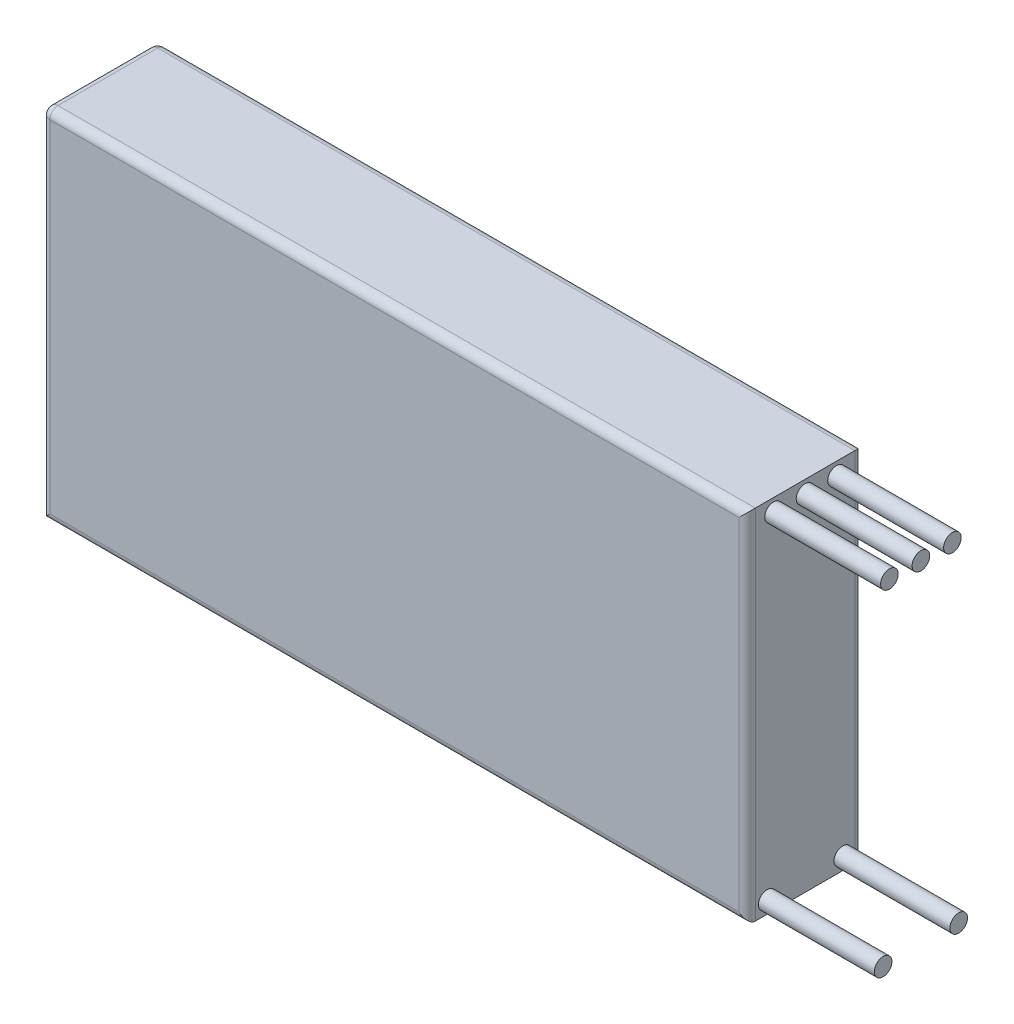
ISO-10303-21;
HEADER;
FILE_DESCRIPTION(('STEP AP214'),'2;1');
FILE_NAME('part.step','',(''),(''),'','','');
FILE_SCHEMA(('AUTOMOTIVE_DESIGN { 1 0 10303 214 1 1 1 1 }'));
ENDSEC;
DATA;
#1=APPLICATION_CONTEXT('core data for automotive mechanical design processes');
#2=APPLICATION_PROTOCOL_DEFINITION('international standard','automotive_design',2000,#1);
#3=PRODUCT_CONTEXT('',#1,'mechanical');
#4=PRODUCT('Part','Part','',(#3));
#5=PRODUCT_RELATED_PRODUCT_CATEGORY('part','',(#4));
#6=PRODUCT_DEFINITION_FORMATION('','',#4);
#7=PRODUCT_DEFINITION_CONTEXT('part definition',#1,'design');
#8=PRODUCT_DEFINITION('design','',#6,#7);
#9=PRODUCT_DEFINITION_SHAPE('','',#8);
#10=(LENGTH_UNIT() NAMED_UNIT(*) SI_UNIT(.MILLI.,.METRE.));
#11=(NAMED_UNIT(*) PLANE_ANGLE_UNIT() SI_UNIT($,.RADIAN.));
#12=(NAMED_UNIT(*) SI_UNIT($,.STERADIAN.) SOLID_ANGLE_UNIT());
#13=UNCERTAINTY_MEASURE_WITH_UNIT(LENGTH_MEASURE(1.E-05),#10,'distance_accuracy_value','');
#14=(GEOMETRIC_REPRESENTATION_CONTEXT(3) GLOBAL_UNCERTAINTY_ASSIGNED_CONTEXT((#13)) GLOBAL_UNIT_ASSIGNED_CONTEXT((#10,
#11,#12)) REPRESENTATION_CONTEXT('',''));
#15=CARTESIAN_POINT('',(0.,0.,0.));
#16=DIRECTION('',(0.,0.,1.));
#17=DIRECTION('',(1.,0.,0.));
#18=AXIS2_PLACEMENT_3D('',#15,#16,#17);
#19=CARTESIAN_POINT('',(0.,0.,11.684));
#20=DIRECTION('',(1.,0.,0.));
#21=DIRECTION('',(0.,0.,-1.));
#22=AXIS2_PLACEMENT_3D('',#19,#20,#21);
#23=PLANE('',#22);
#24=DIRECTION('',(0.,0.,-1.));
#25=VECTOR('',#24,1.);
#26=CARTESIAN_POINT('',(0.,35.2425,11.684));
#27=LINE('',#26,#25);
#28=CARTESIAN_POINT('',(0.,35.2425,10.8585));
#29=VERTEX_POINT('',#28);
#30=CARTESIAN_POINT('',(0.,35.2425,0.8255));
#31=VERTEX_POINT('',#30);
#32=EDGE_CURVE('E182',#29,#31,#27,.T.);
#33=ORIENTED_EDGE('',*,*,#32,.T.);
#34=DIRECTION('',(0.,-1.,0.));
#35=VECTOR('',#34,1.);
#36=CARTESIAN_POINT('',(0.,0.,0.8255));
#37=LINE('',#36,#35);
#38=CARTESIAN_POINT('',(0.,0.,0.8255));
#39=VERTEX_POINT('',#38);
#40=EDGE_CURVE('E188',#31,#39,#37,.T.);
#41=ORIENTED_EDGE('',*,*,#40,.T.);
#42=DIRECTION('',(0.,0.,-1.));
#43=VECTOR('',#42,1.);
#44=CARTESIAN_POINT('',(0.,0.,11.684));
#45=LINE('',#44,#43);
#46=CARTESIAN_POINT('',(0.,0.,10.8585));
#47=VERTEX_POINT('',#46);
#48=EDGE_CURVE('E136',#47,#39,#45,.T.);
#49=ORIENTED_EDGE('',*,*,#48,.F.);
#50=DIRECTION('',(0.,-1.,0.));
#51=VECTOR('',#50,1.);
#52=CARTESIAN_POINT('',(0.,0.,10.8585));
#53=LINE('',#52,#51);
#54=EDGE_CURVE('E185',#47,#29,#53,.F.);
#55=ORIENTED_EDGE('',*,*,#54,.T.);
#56=EDGE_LOOP('',(#33,#41,#49,#55));
#57=FACE_BOUND('',#56,.T.);
#58=ADVANCED_FACE('F41',(#57),#23,.F.);
#59=CARTESIAN_POINT('',(0.,0.,11.684));
#60=DIRECTION('',(0.,1.,0.));
#61=DIRECTION('',(0.,0.,1.));
#62=AXIS2_PLACEMENT_3D('',#59,#60,#61);
#63=PLANE('',#62);
#64=ORIENTED_EDGE('',*,*,#48,.T.);
#65=DIRECTION('',(1.,0.,0.));
#66=VECTOR('',#65,1.);
#67=CARTESIAN_POINT('',(71.12,0.,0.8255));
#68=LINE('',#67,#66);
#69=CARTESIAN_POINT('',(71.12,0.,0.8255));
#70=VERTEX_POINT('',#69);
#71=EDGE_CURVE('E134',#39,#70,#68,.T.);
#72=ORIENTED_EDGE('',*,*,#71,.T.);
#73=DIRECTION('',(0.,0.,-1.));
#74=VECTOR('',#73,1.);
#75=CARTESIAN_POINT('',(71.12,0.,11.684));
#76=LINE('',#75,#74);
#77=CARTESIAN_POINT('',(71.12,0.,10.8585));
#78=VERTEX_POINT('',#77);
#79=EDGE_CURVE('E116',#78,#70,#76,.T.);
#80=ORIENTED_EDGE('',*,*,#79,.F.);
#81=DIRECTION('',(1.,0.,0.));
#82=VECTOR('',#81,1.);
#83=CARTESIAN_POINT('',(0.,0.,10.8585));
#84=LINE('',#83,#82);
#85=EDGE_CURVE('E131',#78,#47,#84,.F.);
#86=ORIENTED_EDGE('',*,*,#85,.T.);
#87=EDGE_LOOP('',(#64,#72,#80,#86));
#88=FACE_BOUND('',#87,.T.);
#89=ADVANCED_FACE('F129',(#88),#63,.F.);
#90=CARTESIAN_POINT('',(71.12,0.,11.684));
#91=DIRECTION('',(-1.,0.,0.));
#92=DIRECTION('',(0.,0.,1.));
#93=AXIS2_PLACEMENT_3D('',#90,#91,#92);
#94=PLANE('',#93);
#95=CARTESIAN_POINT('',(71.12,34.798,2.66700000000001));
#96=DIRECTION('',(-1.,0.,0.));
#97=DIRECTION('',(0.,0.,1.));
#98=AXIS2_PLACEMENT_3D('',#95,#96,#97);
#99=CIRCLE('',#98,0.888999999999993);
#100=CARTESIAN_POINT('',(71.12,34.798,3.556));
#101=VERTEX_POINT('',#100);
#102=EDGE_CURVE('E149',#101,#101,#99,.F.);
#103=ORIENTED_EDGE('',*,*,#102,.F.);
#104=EDGE_LOOP('',(#103));
#105=FACE_BOUND('',#104,.T.);
#106=CARTESIAN_POINT('',(71.12,34.798,5.842));
#107=DIRECTION('',(-1.,0.,0.));
#108=DIRECTION('',(0.,0.,1.));
#109=AXIS2_PLACEMENT_3D('',#106,#107,#108);
#110=CIRCLE('',#109,0.888999999999997);
#111=CARTESIAN_POINT('',(71.12,34.798,6.731));
#112=VERTEX_POINT('',#111);
#113=EDGE_CURVE('E156',#112,#112,#110,.F.);
#114=ORIENTED_EDGE('',*,*,#113,.F.);
#115=EDGE_LOOP('',(#114));
#116=FACE_BOUND('',#115,.T.);
#117=CARTESIAN_POINT('',(71.12,34.798,9.017));
#118=DIRECTION('',(-1.,0.,0.));
#119=DIRECTION('',(0.,0.,1.));
#120=AXIS2_PLACEMENT_3D('',#117,#118,#119);
#121=CIRCLE('',#120,0.888999999999996);
#122=CARTESIAN_POINT('',(71.12,34.798,9.906));
#123=VERTEX_POINT('',#122);
#124=EDGE_CURVE('E261',#123,#123,#121,.F.);
#125=ORIENTED_EDGE('',*,*,#124,.F.);
#126=EDGE_LOOP('',(#125));
#127=FACE_BOUND('',#126,.T.);
#128=CARTESIAN_POINT('',(71.12,1.27,2.032));
#129=DIRECTION('',(-1.,0.,0.));
#130=DIRECTION('',(0.,0.,1.));
#131=AXIS2_PLACEMENT_3D('',#128,#129,#130);
#132=CIRCLE('',#131,0.889);
#133=CARTESIAN_POINT('',(71.12,1.27,2.921));
#134=VERTEX_POINT('',#133);
#135=EDGE_CURVE('E254',#134,#134,#132,.F.);
#136=ORIENTED_EDGE('',*,*,#135,.F.);
#137=EDGE_LOOP('',(#136));
#138=FACE_BOUND('',#137,.T.);
#139=CARTESIAN_POINT('',(71.12,1.27,9.652));
#140=DIRECTION('',(-1.,0.,0.));
#141=DIRECTION('',(0.,0.,1.));
#142=AXIS2_PLACEMENT_3D('',#139,#140,#141);
#143=CIRCLE('',#142,0.889000000000002);
#144=CARTESIAN_POINT('',(71.12,1.27,10.541));
#145=VERTEX_POINT('',#144);
#146=EDGE_CURVE('E250',#145,#145,#143,.F.);
#147=ORIENTED_EDGE('',*,*,#146,.F.);
#148=EDGE_LOOP('',(#147));
#149=FACE_BOUND('',#148,.T.);
#150=ORIENTED_EDGE('',*,*,#79,.T.);
#151=DIRECTION('',(0.,1.,0.));
#152=VECTOR('',#151,1.);
#153=CARTESIAN_POINT('',(71.12,36.068,0.8255));
#154=LINE('',#153,#152);
#155=CARTESIAN_POINT('',(71.12,36.068,0.8255));
#156=VERTEX_POINT('',#155);
#157=EDGE_CURVE('E123',#70,#156,#154,.T.);
#158=ORIENTED_EDGE('',*,*,#157,.T.);
#159=DIRECTION('',(0.,0.,-1.));
#160=VECTOR('',#159,1.);
#161=CARTESIAN_POINT('',(71.12,36.068,11.684));
#162=LINE('',#161,#160);
#163=CARTESIAN_POINT('',(71.12,36.068,10.8585));
#164=VERTEX_POINT('',#163);
#165=EDGE_CURVE('E118',#164,#156,#162,.T.);
#166=ORIENTED_EDGE('',*,*,#165,.F.);
#167=DIRECTION('',(0.,1.,0.));
#168=VECTOR('',#167,1.);
#169=CARTESIAN_POINT('',(71.12,0.,10.8585));
#170=LINE('',#169,#168);
#171=EDGE_CURVE('E113',#164,#78,#170,.F.);
#172=ORIENTED_EDGE('',*,*,#171,.T.);
#173=EDGE_LOOP('',(#150,#158,#166,#172));
#174=FACE_BOUND('',#173,.T.);
#175=ADVANCED_FACE('F115',(#105,#116,#127,#138,#149,#174),#94,.F.);
#176=CARTESIAN_POINT('',(0.,36.068,11.684));
#177=DIRECTION('',(0.,-1.,0.));
#178=DIRECTION('',(0.,0.,-1.));
#179=AXIS2_PLACEMENT_3D('',#176,#177,#178);
#180=PLANE('',#179);
#181=ORIENTED_EDGE('',*,*,#165,.T.);
#182=DIRECTION('',(-1.,0.,0.));
#183=VECTOR('',#182,1.);
#184=CARTESIAN_POINT('',(0.,36.068,0.8255));
#185=LINE('',#184,#183);
#186=CARTESIAN_POINT('',(0.8255,36.068,0.8255));
#187=VERTEX_POINT('',#186);
#188=EDGE_CURVE('E179',#156,#187,#185,.T.);
#189=ORIENTED_EDGE('',*,*,#188,.T.);
#190=DIRECTION('',(0.,0.,-1.));
#191=VECTOR('',#190,1.);
#192=CARTESIAN_POINT('',(0.8255,36.068,11.684));
#193=LINE('',#192,#191);
#194=CARTESIAN_POINT('',(0.8255,36.068,10.8585));
#195=VERTEX_POINT('',#194);
#196=EDGE_CURVE('E173',#187,#195,#193,.F.);
#197=ORIENTED_EDGE('',*,*,#196,.T.);
#198=DIRECTION('',(-1.,0.,0.));
#199=VECTOR('',#198,1.);
#200=CARTESIAN_POINT('',(0.,36.068,10.8585));
#201=LINE('',#200,#199);
#202=EDGE_CURVE('E176',#195,#164,#201,.F.);
#203=ORIENTED_EDGE('',*,*,#202,.T.);
#204=EDGE_LOOP('',(#181,#189,#197,#203));
#205=FACE_BOUND('',#204,.T.);
#206=ADVANCED_FACE('F272',(#205),#180,.F.);
#207=CARTESIAN_POINT('',(0.,0.,11.684));
#208=DIRECTION('',(0.,0.,-1.));
#209=DIRECTION('',(-1.,0.,0.));
#210=AXIS2_PLACEMENT_3D('',#207,#208,#209);
#211=PLANE('',#210);
#212=DIRECTION('',(0.,1.,0.));
#213=VECTOR('',#212,1.);
#214=CARTESIAN_POINT('',(70.2945,0.,11.684));
#215=LINE('',#214,#213);
#216=CARTESIAN_POINT('',(70.2945,0.8255,11.684));
#217=VERTEX_POINT('',#216);
#218=CARTESIAN_POINT('',(70.2945,35.2425,11.684));
#219=VERTEX_POINT('',#218);
#220=EDGE_CURVE('E51',#217,#219,#215,.T.);
#221=ORIENTED_EDGE('',*,*,#220,.T.);
#222=DIRECTION('',(-1.,0.,0.));
#223=VECTOR('',#222,1.);
#224=CARTESIAN_POINT('',(0.,35.2425,11.684));
#225=LINE('',#224,#223);
#226=CARTESIAN_POINT('',(0.8255,35.2425,11.684));
#227=VERTEX_POINT('',#226);
#228=EDGE_CURVE('E11',#219,#227,#225,.T.);
#229=ORIENTED_EDGE('',*,*,#228,.T.);
#230=DIRECTION('',(0.,-1.,0.));
#231=VECTOR('',#230,1.);
#232=CARTESIAN_POINT('',(0.8255,0.,11.684));
#233=LINE('',#232,#231);
#234=CARTESIAN_POINT('',(0.8255,0.8255,11.684));
#235=VERTEX_POINT('',#234);
#236=EDGE_CURVE('E191',#227,#235,#233,.T.);
#237=ORIENTED_EDGE('',*,*,#236,.T.);
#238=DIRECTION('',(1.,0.,0.));
#239=VECTOR('',#238,1.);
#240=CARTESIAN_POINT('',(0.,0.8255,11.684));
#241=LINE('',#240,#239);
#242=EDGE_CURVE('E62',#235,#217,#241,.T.);
#243=ORIENTED_EDGE('',*,*,#242,.T.);
#244=EDGE_LOOP('',(#221,#229,#237,#243));
#245=FACE_BOUND('',#244,.T.);
#246=ADVANCED_FACE('F239',(#245),#211,.F.);
#247=CARTESIAN_POINT('',(0.,0.,0.));
#248=DIRECTION('',(0.,0.,-1.));
#249=DIRECTION('',(-1.,0.,0.));
#250=AXIS2_PLACEMENT_3D('',#247,#248,#249);
#251=PLANE('',#250);
#252=DIRECTION('',(0.,1.,0.));
#253=VECTOR('',#252,1.);
#254=CARTESIAN_POINT('',(70.2945,0.,0.));
#255=LINE('',#254,#253);
#256=CARTESIAN_POINT('',(70.2945,35.2425,0.));
#257=VERTEX_POINT('',#256);
#258=CARTESIAN_POINT('',(70.2945,0.8255,0.));
#259=VERTEX_POINT('',#258);
#260=EDGE_CURVE('E165',#257,#259,#255,.F.);
#261=ORIENTED_EDGE('',*,*,#260,.T.);
#262=DIRECTION('',(1.,0.,0.));
#263=VECTOR('',#262,1.);
#264=CARTESIAN_POINT('',(0.,0.8255,0.));
#265=LINE('',#264,#263);
#266=CARTESIAN_POINT('',(0.8255,0.8255,0.));
#267=VERTEX_POINT('',#266);
#268=EDGE_CURVE('E124',#259,#267,#265,.F.);
#269=ORIENTED_EDGE('',*,*,#268,.T.);
#270=DIRECTION('',(0.,-1.,0.));
#271=VECTOR('',#270,1.);
#272=CARTESIAN_POINT('',(0.8255,36.068,0.));
#273=LINE('',#272,#271);
#274=CARTESIAN_POINT('',(0.8255,35.2425,0.));
#275=VERTEX_POINT('',#274);
#276=EDGE_CURVE('E153',#267,#275,#273,.F.);
#277=ORIENTED_EDGE('',*,*,#276,.T.);
#278=DIRECTION('',(-1.,0.,0.));
#279=VECTOR('',#278,1.);
#280=CARTESIAN_POINT('',(71.12,35.2425,0.));
#281=LINE('',#280,#279);
#282=EDGE_CURVE('E162',#275,#257,#281,.F.);
#283=ORIENTED_EDGE('',*,*,#282,.T.);
#284=EDGE_LOOP('',(#261,#269,#277,#283));
#285=FACE_BOUND('',#284,.T.);
#286=ADVANCED_FACE('F284',(#285),#251,.T.);
#287=CARTESIAN_POINT('',(82.804,1.27,9.652));
#288=DIRECTION('',(-1.,0.,0.));
#289=DIRECTION('',(0.,0.,1.));
#290=AXIS2_PLACEMENT_3D('',#287,#288,#289);
#291=CYLINDRICAL_SURFACE('',#290,0.889000000000002);
#292=CARTESIAN_POINT('',(82.804,1.27,9.652));
#293=DIRECTION('',(1.,0.,0.));
#294=DIRECTION('',(0.,0.,-1.));
#295=AXIS2_PLACEMENT_3D('',#292,#293,#294);
#296=CIRCLE('',#295,0.889000000000002);
#297=CARTESIAN_POINT('',(82.804,1.27,8.763));
#298=VERTEX_POINT('',#297);
#299=EDGE_CURVE('E382',#298,#298,#296,.T.);
#300=ORIENTED_EDGE('',*,*,#299,.F.);
#301=EDGE_LOOP('',(#300));
#302=FACE_BOUND('',#301,.T.);
#303=ORIENTED_EDGE('',*,*,#146,.T.);
#304=EDGE_LOOP('',(#303));
#305=FACE_BOUND('',#304,.T.);
#306=ADVANCED_FACE('F281',(#302,#305),#291,.T.);
#307=CARTESIAN_POINT('',(82.804,1.27,9.652));
#308=DIRECTION('',(1.,0.,0.));
#309=DIRECTION('',(0.,0.,-1.));
#310=AXIS2_PLACEMENT_3D('',#307,#308,#309);
#311=PLANE('',#310);
#312=ORIENTED_EDGE('',*,*,#299,.T.);
#313=EDGE_LOOP('',(#312));
#314=FACE_BOUND('',#313,.T.);
#315=ADVANCED_FACE('F283',(#314),#311,.T.);
#316=CARTESIAN_POINT('',(82.804,1.27,2.032));
#317=DIRECTION('',(-1.,0.,0.));
#318=DIRECTION('',(0.,0.,1.));
#319=AXIS2_PLACEMENT_3D('',#316,#317,#318);
#320=CYLINDRICAL_SURFACE('',#319,0.889);
#321=CARTESIAN_POINT('',(82.804,1.27,2.032));
#322=DIRECTION('',(1.,0.,0.));
#323=DIRECTION('',(0.,0.,-1.));
#324=AXIS2_PLACEMENT_3D('',#321,#322,#323);
#325=CIRCLE('',#324,0.889);
#326=CARTESIAN_POINT('',(82.804,1.27,1.143));
#327=VERTEX_POINT('',#326);
#328=EDGE_CURVE('E380',#327,#327,#325,.T.);
#329=ORIENTED_EDGE('',*,*,#328,.F.);
#330=EDGE_LOOP('',(#329));
#331=FACE_BOUND('',#330,.T.);
#332=ORIENTED_EDGE('',*,*,#135,.T.);
#333=EDGE_LOOP('',(#332));
#334=FACE_BOUND('',#333,.T.);
#335=ADVANCED_FACE('F291',(#331,#334),#320,.T.);
#336=CARTESIAN_POINT('',(82.804,1.27,2.032));
#337=DIRECTION('',(1.,0.,0.));
#338=DIRECTION('',(0.,0.,-1.));
#339=AXIS2_PLACEMENT_3D('',#336,#337,#338);
#340=PLANE('',#339);
#341=ORIENTED_EDGE('',*,*,#328,.T.);
#342=EDGE_LOOP('',(#341));
#343=FACE_BOUND('',#342,.T.);
#344=ADVANCED_FACE('F368',(#343),#340,.T.);
#345=CARTESIAN_POINT('',(82.804,34.798,9.017));
#346=DIRECTION('',(-1.,0.,0.));
#347=DIRECTION('',(0.,0.,1.));
#348=AXIS2_PLACEMENT_3D('',#345,#346,#347);
#349=CYLINDRICAL_SURFACE('',#348,0.888999999999996);
#350=CARTESIAN_POINT('',(82.804,34.798,9.017));
#351=DIRECTION('',(1.,0.,0.));
#352=DIRECTION('',(0.,0.,-1.));
#353=AXIS2_PLACEMENT_3D('',#350,#351,#352);
#354=CIRCLE('',#353,0.888999999999996);
#355=CARTESIAN_POINT('',(82.804,34.798,8.12800000000001));
#356=VERTEX_POINT('',#355);
#357=EDGE_CURVE('E383',#356,#356,#354,.T.);
#358=ORIENTED_EDGE('',*,*,#357,.F.);
#359=EDGE_LOOP('',(#358));
#360=FACE_BOUND('',#359,.T.);
#361=ORIENTED_EDGE('',*,*,#124,.T.);
#362=EDGE_LOOP('',(#361));
#363=FACE_BOUND('',#362,.T.);
#364=ADVANCED_FACE('F364',(#360,#363),#349,.T.);
#365=CARTESIAN_POINT('',(82.804,34.798,9.017));
#366=DIRECTION('',(1.,0.,0.));
#367=DIRECTION('',(0.,0.,-1.));
#368=AXIS2_PLACEMENT_3D('',#365,#366,#367);
#369=PLANE('',#368);
#370=ORIENTED_EDGE('',*,*,#357,.T.);
#371=EDGE_LOOP('',(#370));
#372=FACE_BOUND('',#371,.T.);
#373=ADVANCED_FACE('F360',(#372),#369,.T.);
#374=CARTESIAN_POINT('',(82.804,34.798,5.842));
#375=DIRECTION('',(-1.,0.,0.));
#376=DIRECTION('',(0.,0.,1.));
#377=AXIS2_PLACEMENT_3D('',#374,#375,#376);
#378=CYLINDRICAL_SURFACE('',#377,0.888999999999997);
#379=CARTESIAN_POINT('',(82.804,34.798,5.842));
#380=DIRECTION('',(1.,0.,0.));
#381=DIRECTION('',(0.,0.,-1.));
#382=AXIS2_PLACEMENT_3D('',#379,#380,#381);
#383=CIRCLE('',#382,0.888999999999997);
#384=CARTESIAN_POINT('',(82.804,34.798,4.95300000000001));
#385=VERTEX_POINT('',#384);
#386=EDGE_CURVE('E390',#385,#385,#383,.T.);
#387=ORIENTED_EDGE('',*,*,#386,.F.);
#388=EDGE_LOOP('',(#387));
#389=FACE_BOUND('',#388,.T.);
#390=ORIENTED_EDGE('',*,*,#113,.T.);
#391=EDGE_LOOP('',(#390));
#392=FACE_BOUND('',#391,.T.);
#393=ADVANCED_FACE('F268',(#389,#392),#378,.T.);
#394=CARTESIAN_POINT('',(82.804,34.798,5.842));
#395=DIRECTION('',(1.,0.,0.));
#396=DIRECTION('',(0.,0.,-1.));
#397=AXIS2_PLACEMENT_3D('',#394,#395,#396);
#398=PLANE('',#397);
#399=ORIENTED_EDGE('',*,*,#386,.T.);
#400=EDGE_LOOP('',(#399));
#401=FACE_BOUND('',#400,.T.);
#402=ADVANCED_FACE('F350',(#401),#398,.T.);
#403=CARTESIAN_POINT('',(82.804,34.798,2.66700000000001));
#404=DIRECTION('',(-1.,0.,0.));
#405=DIRECTION('',(0.,0.,1.));
#406=AXIS2_PLACEMENT_3D('',#403,#404,#405);
#407=CYLINDRICAL_SURFACE('',#406,0.888999999999993);
#408=CARTESIAN_POINT('',(82.804,34.798,2.66700000000001));
#409=DIRECTION('',(1.,0.,0.));
#410=DIRECTION('',(0.,0.,-1.));
#411=AXIS2_PLACEMENT_3D('',#408,#409,#410);
#412=CIRCLE('',#411,0.888999999999993);
#413=CARTESIAN_POINT('',(82.804,34.798,1.77800000000001));
#414=VERTEX_POINT('',#413);
#415=EDGE_CURVE('E141',#414,#414,#412,.T.);
#416=ORIENTED_EDGE('',*,*,#415,.F.);
#417=EDGE_LOOP('',(#416));
#418=FACE_BOUND('',#417,.T.);
#419=ORIENTED_EDGE('',*,*,#102,.T.);
#420=EDGE_LOOP('',(#419));
#421=FACE_BOUND('',#420,.T.);
#422=ADVANCED_FACE('F344',(#418,#421),#407,.T.);
#423=CARTESIAN_POINT('',(82.804,34.798,2.66700000000001));
#424=DIRECTION('',(1.,0.,0.));
#425=DIRECTION('',(0.,0.,-1.));
#426=AXIS2_PLACEMENT_3D('',#423,#424,#425);
#427=PLANE('',#426);
#428=ORIENTED_EDGE('',*,*,#415,.T.);
#429=EDGE_LOOP('',(#428));
#430=FACE_BOUND('',#429,.T.);
#431=ADVANCED_FACE('F340',(#430),#427,.T.);
#432=CARTESIAN_POINT('',(70.2945,0.,10.8585));
#433=DIRECTION('',(0.,1.,0.));
#434=DIRECTION('',(0.,0.,1.));
#435=AXIS2_PLACEMENT_3D('',#432,#433,#434);
#436=CYLINDRICAL_SURFACE('',#435,0.8255);
#437=CARTESIAN_POINT('',(70.2945,35.2425,10.8585));
#438=DIRECTION('',(-0.707106781186547,0.707106781186547,0.));
#439=DIRECTION('',(0.707106781186547,0.707106781186547,0.));
#440=AXIS2_PLACEMENT_3D('',#437,#438,#439);
#441=ELLIPSE('',#440,1.16743329573899,0.8255);
#442=EDGE_CURVE('E142',#219,#164,#441,.T.);
#443=ORIENTED_EDGE('',*,*,#442,.F.);
#444=ORIENTED_EDGE('',*,*,#220,.F.);
#445=CARTESIAN_POINT('',(70.2945,0.8255,10.8585));
#446=DIRECTION('',(0.707106781186547,0.707106781186547,0.));
#447=DIRECTION('',(0.707106781186547,-0.707106781186547,0.));
#448=AXIS2_PLACEMENT_3D('',#445,#446,#447);
#449=ELLIPSE('',#448,1.16743329573899,0.8255);
#450=EDGE_CURVE('E45',#78,#217,#449,.F.);
#451=ORIENTED_EDGE('',*,*,#450,.F.);
#452=ORIENTED_EDGE('',*,*,#171,.F.);
#453=EDGE_LOOP('',(#443,#444,#451,#452));
#454=FACE_BOUND('',#453,.T.);
#455=ADVANCED_FACE('F43',(#454),#436,.T.);
#456=CARTESIAN_POINT('',(0.,0.8255,10.8585));
#457=DIRECTION('',(1.,0.,0.));
#458=DIRECTION('',(0.,0.,-1.));
#459=AXIS2_PLACEMENT_3D('',#456,#457,#458);
#460=CYLINDRICAL_SURFACE('',#459,0.8255);
#461=ORIENTED_EDGE('',*,*,#450,.T.);
#462=ORIENTED_EDGE('',*,*,#242,.F.);
#463=CARTESIAN_POINT('',(0.8255,0.8255,10.8585));
#464=DIRECTION('',(0.707106781186547,-0.707106781186547,0.));
#465=DIRECTION('',(-0.707106781186547,-0.707106781186547,0.));
#466=AXIS2_PLACEMENT_3D('',#463,#464,#465);
#467=ELLIPSE('',#466,1.16743329573899,0.8255);
#468=EDGE_CURVE('E146',#47,#235,#467,.F.);
#469=ORIENTED_EDGE('',*,*,#468,.F.);
#470=ORIENTED_EDGE('',*,*,#85,.F.);
#471=EDGE_LOOP('',(#461,#462,#469,#470));
#472=FACE_BOUND('',#471,.T.);
#473=ADVANCED_FACE('F144',(#472),#460,.T.);
#474=CARTESIAN_POINT('',(0.,35.2425,10.8585));
#475=DIRECTION('',(-1.,0.,0.));
#476=DIRECTION('',(0.,0.,1.));
#477=AXIS2_PLACEMENT_3D('',#474,#475,#476);
#478=CYLINDRICAL_SURFACE('',#477,0.8255);
#479=ORIENTED_EDGE('',*,*,#442,.T.);
#480=ORIENTED_EDGE('',*,*,#202,.F.);
#481=CARTESIAN_POINT('',(0.8255,35.2425,10.8585));
#482=DIRECTION('',(-1.,0.,0.));
#483=DIRECTION('',(0.,0.,1.));
#484=AXIS2_PLACEMENT_3D('',#481,#482,#483);
#485=CIRCLE('',#484,0.8255);
#486=EDGE_CURVE('E227',#227,#195,#485,.T.);
#487=ORIENTED_EDGE('',*,*,#486,.F.);
#488=ORIENTED_EDGE('',*,*,#228,.F.);
#489=EDGE_LOOP('',(#479,#480,#487,#488));
#490=FACE_BOUND('',#489,.T.);
#491=ADVANCED_FACE('F236',(#490),#478,.T.);
#492=CARTESIAN_POINT('',(0.8255,0.,10.8585));
#493=DIRECTION('',(0.,-1.,0.));
#494=DIRECTION('',(0.,0.,-1.));
#495=AXIS2_PLACEMENT_3D('',#492,#493,#494);
#496=CYLINDRICAL_SURFACE('',#495,0.8255);
#497=ORIENTED_EDGE('',*,*,#468,.T.);
#498=ORIENTED_EDGE('',*,*,#236,.F.);
#499=CARTESIAN_POINT('',(0.8255,35.2425,10.8585));
#500=DIRECTION('',(0.,1.,0.));
#501=DIRECTION('',(0.,0.,1.));
#502=AXIS2_PLACEMENT_3D('',#499,#500,#501);
#503=CIRCLE('',#502,0.8255);
#504=EDGE_CURVE('E224',#29,#227,#503,.T.);
#505=ORIENTED_EDGE('',*,*,#504,.F.);
#506=ORIENTED_EDGE('',*,*,#54,.F.);
#507=EDGE_LOOP('',(#497,#498,#505,#506));
#508=FACE_BOUND('',#507,.T.);
#509=ADVANCED_FACE('F242',(#508),#496,.T.);
#510=CARTESIAN_POINT('',(0.8255,35.2425,10.8585));
#511=DIRECTION('',(0.,0.,1.));
#512=DIRECTION('',(1.,0.,0.));
#513=AXIS2_PLACEMENT_3D('',#510,#511,#512);
#514=SPHERICAL_SURFACE('',#513,0.8255);
#515=ORIENTED_EDGE('',*,*,#504,.T.);
#516=ORIENTED_EDGE('',*,*,#486,.T.);
#517=CARTESIAN_POINT('',(0.8255,35.2425,10.8585));
#518=DIRECTION('',(0.,0.,1.));
#519=DIRECTION('',(1.,0.,0.));
#520=AXIS2_PLACEMENT_3D('',#517,#518,#519);
#521=CIRCLE('',#520,0.8255);
#522=EDGE_CURVE('E220',#29,#195,#521,.F.);
#523=ORIENTED_EDGE('',*,*,#522,.F.);
#524=EDGE_LOOP('',(#515,#516,#523));
#525=FACE_BOUND('',#524,.T.);
#526=ADVANCED_FACE('F328',(#525),#514,.T.);
#527=CARTESIAN_POINT('',(0.8255,35.2425,11.684));
#528=DIRECTION('',(0.,0.,-1.));
#529=DIRECTION('',(-1.,0.,0.));
#530=AXIS2_PLACEMENT_3D('',#527,#528,#529);
#531=CYLINDRICAL_SURFACE('',#530,0.8255);
#532=CARTESIAN_POINT('',(0.8255,35.2425,0.8255));
#533=DIRECTION('',(0.,0.,-1.));
#534=DIRECTION('',(-1.,0.,0.));
#535=AXIS2_PLACEMENT_3D('',#532,#533,#534);
#536=CIRCLE('',#535,0.8255);
#537=EDGE_CURVE('E216',#31,#187,#536,.T.);
#538=ORIENTED_EDGE('',*,*,#537,.F.);
#539=ORIENTED_EDGE('',*,*,#32,.F.);
#540=ORIENTED_EDGE('',*,*,#522,.T.);
#541=ORIENTED_EDGE('',*,*,#196,.F.);
#542=EDGE_LOOP('',(#538,#539,#540,#541));
#543=FACE_BOUND('',#542,.T.);
#544=ADVANCED_FACE('F324',(#543),#531,.T.);
#545=CARTESIAN_POINT('',(0.8255,35.2425,0.8255));
#546=DIRECTION('',(0.,1.,0.));
#547=DIRECTION('',(0.,0.,1.));
#548=AXIS2_PLACEMENT_3D('',#545,#546,#547);
#549=SPHERICAL_SURFACE('',#548,0.8255);
#550=CARTESIAN_POINT('',(0.8255,35.2425,0.8255));
#551=DIRECTION('',(0.,1.,0.));
#552=DIRECTION('',(0.,0.,1.));
#553=AXIS2_PLACEMENT_3D('',#550,#551,#552);
#554=CIRCLE('',#553,0.8255);
#555=EDGE_CURVE('E208',#31,#275,#554,.F.);
#556=ORIENTED_EDGE('',*,*,#555,.F.);
#557=ORIENTED_EDGE('',*,*,#537,.T.);
#558=CARTESIAN_POINT('',(0.8255,35.2425,0.8255));
#559=DIRECTION('',(-1.,0.,0.));
#560=DIRECTION('',(0.,0.,1.));
#561=AXIS2_PLACEMENT_3D('',#558,#559,#560);
#562=CIRCLE('',#561,0.8255);
#563=EDGE_CURVE('E212',#275,#187,#562,.F.);
#564=ORIENTED_EDGE('',*,*,#563,.F.);
#565=EDGE_LOOP('',(#556,#557,#564));
#566=FACE_BOUND('',#565,.T.);
#567=ADVANCED_FACE('F320',(#566),#549,.T.);
#568=CARTESIAN_POINT('',(0.,35.2425,0.8255));
#569=DIRECTION('',(1.,0.,0.));
#570=DIRECTION('',(0.,0.,-1.));
#571=AXIS2_PLACEMENT_3D('',#568,#569,#570);
#572=CYLINDRICAL_SURFACE('',#571,0.8255);
#573=ORIENTED_EDGE('',*,*,#563,.T.);
#574=ORIENTED_EDGE('',*,*,#188,.F.);
#575=CARTESIAN_POINT('',(70.2945,35.2425,0.8255));
#576=DIRECTION('',(0.707106781186547,-0.707106781186547,0.));
#577=DIRECTION('',(0.707106781186547,0.707106781186547,0.));
#578=AXIS2_PLACEMENT_3D('',#575,#576,#577);
#579=ELLIPSE('',#578,1.16743329573899,0.8255);
#580=EDGE_CURVE('E204',#257,#156,#579,.T.);
#581=ORIENTED_EDGE('',*,*,#580,.F.);
#582=ORIENTED_EDGE('',*,*,#282,.F.);
#583=EDGE_LOOP('',(#573,#574,#581,#582));
#584=FACE_BOUND('',#583,.T.);
#585=ADVANCED_FACE('F316',(#584),#572,.T.);
#586=CARTESIAN_POINT('',(0.8255,0.,0.8255));
#587=DIRECTION('',(0.,1.,0.));
#588=DIRECTION('',(0.,0.,1.));
#589=AXIS2_PLACEMENT_3D('',#586,#587,#588);
#590=CYLINDRICAL_SURFACE('',#589,0.8255);
#591=ORIENTED_EDGE('',*,*,#555,.T.);
#592=ORIENTED_EDGE('',*,*,#276,.F.);
#593=CARTESIAN_POINT('',(0.8255,0.8255,0.8255));
#594=DIRECTION('',(-0.707106781186547,0.707106781186547,0.));
#595=DIRECTION('',(0.707106781186547,0.707106781186547,0.));
#596=AXIS2_PLACEMENT_3D('',#593,#594,#595);
#597=ELLIPSE('',#596,1.16743329573899,0.8255);
#598=EDGE_CURVE('E201',#39,#267,#597,.F.);
#599=ORIENTED_EDGE('',*,*,#598,.F.);
#600=ORIENTED_EDGE('',*,*,#40,.F.);
#601=EDGE_LOOP('',(#591,#592,#599,#600));
#602=FACE_BOUND('',#601,.T.);
#603=ADVANCED_FACE('F312',(#602),#590,.T.);
#604=CARTESIAN_POINT('',(70.2945,0.,0.8255));
#605=DIRECTION('',(0.,-1.,0.));
#606=DIRECTION('',(0.,0.,-1.));
#607=AXIS2_PLACEMENT_3D('',#604,#605,#606);
#608=CYLINDRICAL_SURFACE('',#607,0.8255);
#609=ORIENTED_EDGE('',*,*,#580,.T.);
#610=ORIENTED_EDGE('',*,*,#157,.F.);
#611=CARTESIAN_POINT('',(70.2945,0.8255,0.8255));
#612=DIRECTION('',(-0.707106781186547,-0.707106781186547,0.));
#613=DIRECTION('',(0.707106781186547,-0.707106781186547,0.));
#614=AXIS2_PLACEMENT_3D('',#611,#612,#613);
#615=ELLIPSE('',#614,1.16743329573899,0.8255);
#616=EDGE_CURVE('E198',#259,#70,#615,.T.);
#617=ORIENTED_EDGE('',*,*,#616,.F.);
#618=ORIENTED_EDGE('',*,*,#260,.F.);
#619=EDGE_LOOP('',(#609,#610,#617,#618));
#620=FACE_BOUND('',#619,.T.);
#621=ADVANCED_FACE('F308',(#620),#608,.T.);
#622=CARTESIAN_POINT('',(0.,0.8255,0.8255));
#623=DIRECTION('',(-1.,0.,0.));
#624=DIRECTION('',(0.,0.,1.));
#625=AXIS2_PLACEMENT_3D('',#622,#623,#624);
#626=CYLINDRICAL_SURFACE('',#625,0.8255);
#627=ORIENTED_EDGE('',*,*,#598,.T.);
#628=ORIENTED_EDGE('',*,*,#268,.F.);
#629=ORIENTED_EDGE('',*,*,#616,.T.);
#630=ORIENTED_EDGE('',*,*,#71,.F.);
#631=EDGE_LOOP('',(#627,#628,#629,#630));
#632=FACE_BOUND('',#631,.T.);
#633=ADVANCED_FACE('F305',(#632),#626,.T.);
#634=CLOSED_SHELL('',(#58,#89,#175,#206,#246,#286,#306,#315,#335,#344,#364,#373,#393,#402,#422,
#431,#455,#473,#491,#509,#526,#544,#567,#585,#603,#621,#633));
#635=MANIFOLD_SOLID_BREP('B2',#634);
#636=ADVANCED_BREP_SHAPE_REPRESENTATION('',(#18,#635),#14);
#637=SHAPE_DEFINITION_REPRESENTATION(#9,#636);
ENDSEC;
END-ISO-10303-21;
